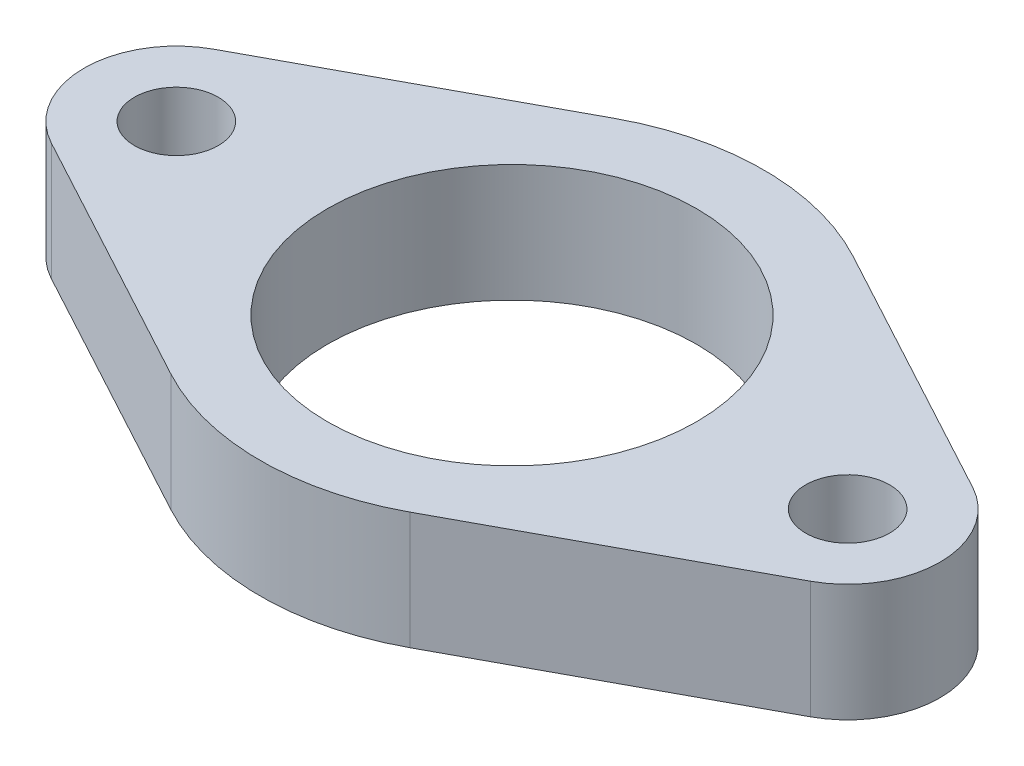
ISO-10303-21;
HEADER;
FILE_DESCRIPTION(('STEP AP214'),'2;1');
FILE_NAME('part.step','',(''),(''),'','','');
FILE_SCHEMA(('AUTOMOTIVE_DESIGN { 1 0 10303 214 1 1 1 1 }'));
ENDSEC;
DATA;
#1=APPLICATION_CONTEXT('core data for automotive mechanical design processes');
#2=APPLICATION_PROTOCOL_DEFINITION('international standard','automotive_design',2000,#1);
#3=PRODUCT_CONTEXT('',#1,'mechanical');
#4=PRODUCT('Part','Part','',(#3));
#5=PRODUCT_RELATED_PRODUCT_CATEGORY('part','',(#4));
#6=PRODUCT_DEFINITION_FORMATION('','',#4);
#7=PRODUCT_DEFINITION_CONTEXT('part definition',#1,'design');
#8=PRODUCT_DEFINITION('design','',#6,#7);
#9=PRODUCT_DEFINITION_SHAPE('','',#8);
#10=(LENGTH_UNIT() NAMED_UNIT(*) SI_UNIT(.MILLI.,.METRE.));
#11=(NAMED_UNIT(*) PLANE_ANGLE_UNIT() SI_UNIT($,.RADIAN.));
#12=(NAMED_UNIT(*) SI_UNIT($,.STERADIAN.) SOLID_ANGLE_UNIT());
#13=UNCERTAINTY_MEASURE_WITH_UNIT(LENGTH_MEASURE(1.E-05),#10,'distance_accuracy_value','');
#14=(GEOMETRIC_REPRESENTATION_CONTEXT(3) GLOBAL_UNCERTAINTY_ASSIGNED_CONTEXT((#13)) GLOBAL_UNIT_ASSIGNED_CONTEXT((#10,
#11,#12)) REPRESENTATION_CONTEXT('',''));
#15=CARTESIAN_POINT('',(0.,0.,0.));
#16=DIRECTION('',(0.,0.,1.));
#17=DIRECTION('',(1.,0.,0.));
#18=AXIS2_PLACEMENT_3D('',#15,#16,#17);
#19=CARTESIAN_POINT('',(-20.,7.,0.));
#20=DIRECTION('',(0.,1.,0.));
#21=DIRECTION('',(0.,0.,1.));
#22=AXIS2_PLACEMENT_3D('',#19,#20,#21);
#23=PLANE('',#22);
#24=CARTESIAN_POINT('',(-20.,7.,0.));
#25=DIRECTION('',(0.,1.,0.));
#26=DIRECTION('',(0.,0.,1.));
#27=AXIS2_PLACEMENT_3D('',#24,#25,#26);
#28=CIRCLE('',#27,2.5);
#29=CARTESIAN_POINT('',(-20.,7.,2.5));
#30=VERTEX_POINT('',#29);
#31=EDGE_CURVE('E184',#30,#30,#28,.T.);
#32=ORIENTED_EDGE('',*,*,#31,.F.);
#33=EDGE_LOOP('',(#32));
#34=FACE_BOUND('',#33,.T.);
#35=CARTESIAN_POINT('',(-20.,7.,0.));
#36=DIRECTION('',(0.,1.,0.));
#37=DIRECTION('',(0.,0.,1.));
#38=AXIS2_PLACEMENT_3D('',#35,#36,#37);
#39=CIRCLE('',#38,5.5);
#40=CARTESIAN_POINT('',(-22.6125,7.,-4.83992187436946));
#41=VERTEX_POINT('',#40);
#42=CARTESIAN_POINT('',(-22.6125,7.,4.83992187436946));
#43=VERTEX_POINT('',#42);
#44=EDGE_CURVE('E147',#41,#43,#39,.T.);
#45=ORIENTED_EDGE('',*,*,#44,.T.);
#46=DIRECTION('',(0.879985795339902,0.,0.475));
#47=VECTOR('',#46,1.);
#48=CARTESIAN_POINT('',(-22.6125,7.,4.83992187436946));
#49=LINE('',#48,#47);
#50=CARTESIAN_POINT('',(-7.125,7.,13.1997869300985));
#51=VERTEX_POINT('',#50);
#52=EDGE_CURVE('E95',#43,#51,#49,.T.);
#53=ORIENTED_EDGE('',*,*,#52,.T.);
#54=CARTESIAN_POINT('',(0.,7.,0.));
#55=DIRECTION('',(0.,1.,0.));
#56=DIRECTION('',(0.,0.,1.));
#57=AXIS2_PLACEMENT_3D('',#54,#55,#56);
#58=CIRCLE('',#57,15.);
#59=CARTESIAN_POINT('',(7.125,7.,13.1997869300985));
#60=VERTEX_POINT('',#59);
#61=EDGE_CURVE('E162',#51,#60,#58,.T.);
#62=ORIENTED_EDGE('',*,*,#61,.T.);
#63=DIRECTION('',(0.879985795339902,0.,-0.475));
#64=VECTOR('',#63,1.);
#65=CARTESIAN_POINT('',(22.6125,7.,4.83992187436946));
#66=LINE('',#65,#64);
#67=CARTESIAN_POINT('',(22.6125,7.,4.83992187436946));
#68=VERTEX_POINT('',#67);
#69=EDGE_CURVE('E175',#60,#68,#66,.T.);
#70=ORIENTED_EDGE('',*,*,#69,.T.);
#71=CARTESIAN_POINT('',(20.,7.,0.));
#72=DIRECTION('',(0.,1.,0.));
#73=DIRECTION('',(0.,0.,-1.));
#74=AXIS2_PLACEMENT_3D('',#71,#72,#73);
#75=CIRCLE('',#74,5.5);
#76=CARTESIAN_POINT('',(22.6125,7.,-4.83992187436946));
#77=VERTEX_POINT('',#76);
#78=EDGE_CURVE('E114',#68,#77,#75,.T.);
#79=ORIENTED_EDGE('',*,*,#78,.T.);
#80=DIRECTION('',(-0.879985795339902,0.,-0.475));
#81=VECTOR('',#80,1.);
#82=CARTESIAN_POINT('',(22.6125,7.,-4.83992187436946));
#83=LINE('',#82,#81);
#84=CARTESIAN_POINT('',(7.125,7.,-13.1997869300985));
#85=VERTEX_POINT('',#84);
#86=EDGE_CURVE('E108',#77,#85,#83,.T.);
#87=ORIENTED_EDGE('',*,*,#86,.T.);
#88=CARTESIAN_POINT('',(0.,7.,0.));
#89=DIRECTION('',(0.,1.,0.));
#90=DIRECTION('',(0.,0.,1.));
#91=AXIS2_PLACEMENT_3D('',#88,#89,#90);
#92=CIRCLE('',#91,15.);
#93=CARTESIAN_POINT('',(-7.125,7.,-13.1997869300985));
#94=VERTEX_POINT('',#93);
#95=EDGE_CURVE('E112',#85,#94,#92,.T.);
#96=ORIENTED_EDGE('',*,*,#95,.T.);
#97=DIRECTION('',(-0.879985795339902,0.,0.475));
#98=VECTOR('',#97,1.);
#99=CARTESIAN_POINT('',(-22.6125,7.,-4.83992187436946));
#100=LINE('',#99,#98);
#101=EDGE_CURVE('E52',#94,#41,#100,.T.);
#102=ORIENTED_EDGE('',*,*,#101,.T.);
#103=EDGE_LOOP('',(#45,#53,#62,#70,#79,#87,#96,#102));
#104=FACE_BOUND('',#103,.T.);
#105=CARTESIAN_POINT('',(0.,7.,0.));
#106=DIRECTION('',(0.,1.,0.));
#107=DIRECTION('',(0.,0.,1.));
#108=AXIS2_PLACEMENT_3D('',#105,#106,#107);
#109=CIRCLE('',#108,11.);
#110=CARTESIAN_POINT('',(0.,7.,11.));
#111=VERTEX_POINT('',#110);
#112=EDGE_CURVE('E136',#111,#111,#109,.T.);
#113=ORIENTED_EDGE('',*,*,#112,.F.);
#114=EDGE_LOOP('',(#113));
#115=FACE_BOUND('',#114,.T.);
#116=CARTESIAN_POINT('',(20.,7.,0.));
#117=DIRECTION('',(0.,1.,0.));
#118=DIRECTION('',(0.,0.,-1.));
#119=AXIS2_PLACEMENT_3D('',#116,#117,#118);
#120=CIRCLE('',#119,2.5);
#121=CARTESIAN_POINT('',(20.,7.,-2.5));
#122=VERTEX_POINT('',#121);
#123=EDGE_CURVE('E190',#122,#122,#120,.T.);
#124=ORIENTED_EDGE('',*,*,#123,.F.);
#125=EDGE_LOOP('',(#124));
#126=FACE_BOUND('',#125,.T.);
#127=ADVANCED_FACE('F35',(#34,#104,#115,#126),#23,.T.);
#128=CARTESIAN_POINT('',(-20.,0.,0.));
#129=DIRECTION('',(0.,1.,0.));
#130=DIRECTION('',(0.,0.,1.));
#131=AXIS2_PLACEMENT_3D('',#128,#129,#130);
#132=PLANE('',#131);
#133=CARTESIAN_POINT('',(-20.,0.,0.));
#134=DIRECTION('',(0.,1.,0.));
#135=DIRECTION('',(0.,0.,1.));
#136=AXIS2_PLACEMENT_3D('',#133,#134,#135);
#137=CIRCLE('',#136,5.5);
#138=CARTESIAN_POINT('',(-22.6125,0.,-4.83992187436946));
#139=VERTEX_POINT('',#138);
#140=CARTESIAN_POINT('',(-22.6125,0.,4.83992187436946));
#141=VERTEX_POINT('',#140);
#142=EDGE_CURVE('E132',#139,#141,#137,.T.);
#143=ORIENTED_EDGE('',*,*,#142,.F.);
#144=DIRECTION('',(-0.879985795339902,0.,0.475));
#145=VECTOR('',#144,1.);
#146=CARTESIAN_POINT('',(-22.6125,0.,-4.83992187436946));
#147=LINE('',#146,#145);
#148=CARTESIAN_POINT('',(-7.125,0.,-13.1997869300985));
#149=VERTEX_POINT('',#148);
#150=EDGE_CURVE('E87',#149,#139,#147,.T.);
#151=ORIENTED_EDGE('',*,*,#150,.F.);
#152=CARTESIAN_POINT('',(0.,0.,0.));
#153=DIRECTION('',(0.,1.,0.));
#154=DIRECTION('',(0.,0.,1.));
#155=AXIS2_PLACEMENT_3D('',#152,#153,#154);
#156=CIRCLE('',#155,15.);
#157=CARTESIAN_POINT('',(7.125,0.,-13.1997869300985));
#158=VERTEX_POINT('',#157);
#159=EDGE_CURVE('E81',#158,#149,#156,.T.);
#160=ORIENTED_EDGE('',*,*,#159,.F.);
#161=DIRECTION('',(-0.879985795339902,0.,-0.475));
#162=VECTOR('',#161,1.);
#163=CARTESIAN_POINT('',(22.6125,0.,-4.83992187436946));
#164=LINE('',#163,#162);
#165=CARTESIAN_POINT('',(22.6125,0.,-4.83992187436946));
#166=VERTEX_POINT('',#165);
#167=EDGE_CURVE('E122',#166,#158,#164,.T.);
#168=ORIENTED_EDGE('',*,*,#167,.F.);
#169=CARTESIAN_POINT('',(20.,0.,0.));
#170=DIRECTION('',(0.,1.,0.));
#171=DIRECTION('',(0.,0.,-1.));
#172=AXIS2_PLACEMENT_3D('',#169,#170,#171);
#173=CIRCLE('',#172,5.5);
#174=CARTESIAN_POINT('',(22.6125,0.,4.83992187436946));
#175=VERTEX_POINT('',#174);
#176=EDGE_CURVE('E142',#175,#166,#173,.T.);
#177=ORIENTED_EDGE('',*,*,#176,.F.);
#178=DIRECTION('',(0.879985795339902,0.,-0.475));
#179=VECTOR('',#178,1.);
#180=CARTESIAN_POINT('',(22.6125,0.,4.83992187436946));
#181=LINE('',#180,#179);
#182=CARTESIAN_POINT('',(7.125,0.,13.1997869300985));
#183=VERTEX_POINT('',#182);
#184=EDGE_CURVE('E140',#183,#175,#181,.T.);
#185=ORIENTED_EDGE('',*,*,#184,.F.);
#186=CARTESIAN_POINT('',(0.,0.,0.));
#187=DIRECTION('',(0.,1.,0.));
#188=DIRECTION('',(0.,0.,1.));
#189=AXIS2_PLACEMENT_3D('',#186,#187,#188);
#190=CIRCLE('',#189,15.);
#191=CARTESIAN_POINT('',(-7.125,0.,13.1997869300985));
#192=VERTEX_POINT('',#191);
#193=EDGE_CURVE('E138',#192,#183,#190,.T.);
#194=ORIENTED_EDGE('',*,*,#193,.F.);
#195=DIRECTION('',(0.879985795339902,0.,0.475));
#196=VECTOR('',#195,1.);
#197=CARTESIAN_POINT('',(-22.6125,0.,4.83992187436946));
#198=LINE('',#197,#196);
#199=EDGE_CURVE('E135',#141,#192,#198,.T.);
#200=ORIENTED_EDGE('',*,*,#199,.F.);
#201=EDGE_LOOP('',(#143,#151,#160,#168,#177,#185,#194,#200));
#202=FACE_BOUND('',#201,.T.);
#203=CARTESIAN_POINT('',(0.,0.,0.));
#204=DIRECTION('',(0.,1.,0.));
#205=DIRECTION('',(0.,0.,1.));
#206=AXIS2_PLACEMENT_3D('',#203,#204,#205);
#207=CIRCLE('',#206,11.);
#208=CARTESIAN_POINT('',(0.,0.,11.));
#209=VERTEX_POINT('',#208);
#210=EDGE_CURVE('E181',#209,#209,#207,.T.);
#211=ORIENTED_EDGE('',*,*,#210,.T.);
#212=EDGE_LOOP('',(#211));
#213=FACE_BOUND('',#212,.T.);
#214=CARTESIAN_POINT('',(-20.,0.,0.));
#215=DIRECTION('',(0.,1.,0.));
#216=DIRECTION('',(0.,0.,1.));
#217=AXIS2_PLACEMENT_3D('',#214,#215,#216);
#218=CIRCLE('',#217,2.5);
#219=CARTESIAN_POINT('',(-20.,0.,2.5));
#220=VERTEX_POINT('',#219);
#221=EDGE_CURVE('E187',#220,#220,#218,.T.);
#222=ORIENTED_EDGE('',*,*,#221,.T.);
#223=EDGE_LOOP('',(#222));
#224=FACE_BOUND('',#223,.T.);
#225=CARTESIAN_POINT('',(20.,0.,0.));
#226=DIRECTION('',(0.,1.,0.));
#227=DIRECTION('',(0.,0.,-1.));
#228=AXIS2_PLACEMENT_3D('',#225,#226,#227);
#229=CIRCLE('',#228,2.5);
#230=CARTESIAN_POINT('',(20.,0.,-2.5));
#231=VERTEX_POINT('',#230);
#232=EDGE_CURVE('E193',#231,#231,#229,.T.);
#233=ORIENTED_EDGE('',*,*,#232,.T.);
#234=EDGE_LOOP('',(#233));
#235=FACE_BOUND('',#234,.T.);
#236=ADVANCED_FACE('F166',(#202,#213,#224,#235),#132,.F.);
#237=CARTESIAN_POINT('',(-20.,7.,0.));
#238=DIRECTION('',(0.,-1.,0.));
#239=DIRECTION('',(0.,0.,-1.));
#240=AXIS2_PLACEMENT_3D('',#237,#238,#239);
#241=CYLINDRICAL_SURFACE('',#240,5.5);
#242=ORIENTED_EDGE('',*,*,#142,.T.);
#243=DIRECTION('',(0.,-1.,0.));
#244=VECTOR('',#243,1.);
#245=CARTESIAN_POINT('',(-22.6125,7.,4.83992187436946));
#246=LINE('',#245,#244);
#247=EDGE_CURVE('E11',#43,#141,#246,.T.);
#248=ORIENTED_EDGE('',*,*,#247,.F.);
#249=ORIENTED_EDGE('',*,*,#44,.F.);
#250=DIRECTION('',(0.,-1.,0.));
#251=VECTOR('',#250,1.);
#252=CARTESIAN_POINT('',(-22.6125,7.,-4.83992187436946));
#253=LINE('',#252,#251);
#254=EDGE_CURVE('E128',#41,#139,#253,.T.);
#255=ORIENTED_EDGE('',*,*,#254,.T.);
#256=EDGE_LOOP('',(#242,#248,#249,#255));
#257=FACE_BOUND('',#256,.T.);
#258=ADVANCED_FACE('F37',(#257),#241,.T.);
#259=CARTESIAN_POINT('',(-22.6125,7.,4.83992187436946));
#260=DIRECTION('',(0.475,0.,-0.879985795339902));
#261=DIRECTION('',(-0.879985795339902,0.,-0.475));
#262=AXIS2_PLACEMENT_3D('',#259,#260,#261);
#263=PLANE('',#262);
#264=ORIENTED_EDGE('',*,*,#199,.T.);
#265=DIRECTION('',(0.,-1.,0.));
#266=VECTOR('',#265,1.);
#267=CARTESIAN_POINT('',(-7.125,7.,13.1997869300985));
#268=LINE('',#267,#266);
#269=EDGE_CURVE('E44',#51,#192,#268,.T.);
#270=ORIENTED_EDGE('',*,*,#269,.F.);
#271=ORIENTED_EDGE('',*,*,#52,.F.);
#272=ORIENTED_EDGE('',*,*,#247,.T.);
#273=EDGE_LOOP('',(#264,#270,#271,#272));
#274=FACE_BOUND('',#273,.T.);
#275=ADVANCED_FACE('F226',(#274),#263,.F.);
#276=CARTESIAN_POINT('',(0.,7.,0.));
#277=DIRECTION('',(0.,-1.,0.));
#278=DIRECTION('',(0.,0.,-1.));
#279=AXIS2_PLACEMENT_3D('',#276,#277,#278);
#280=CYLINDRICAL_SURFACE('',#279,15.);
#281=ORIENTED_EDGE('',*,*,#193,.T.);
#282=DIRECTION('',(0.,-1.,0.));
#283=VECTOR('',#282,1.);
#284=CARTESIAN_POINT('',(7.125,7.,13.1997869300985));
#285=LINE('',#284,#283);
#286=EDGE_CURVE('E154',#60,#183,#285,.T.);
#287=ORIENTED_EDGE('',*,*,#286,.F.);
#288=ORIENTED_EDGE('',*,*,#61,.F.);
#289=ORIENTED_EDGE('',*,*,#269,.T.);
#290=EDGE_LOOP('',(#281,#287,#288,#289));
#291=FACE_BOUND('',#290,.T.);
#292=ADVANCED_FACE('F160',(#291),#280,.T.);
#293=CARTESIAN_POINT('',(22.6125,7.,4.83992187436946));
#294=DIRECTION('',(-0.475,0.,-0.879985795339902));
#295=DIRECTION('',(-0.879985795339902,0.,0.475));
#296=AXIS2_PLACEMENT_3D('',#293,#294,#295);
#297=PLANE('',#296);
#298=ORIENTED_EDGE('',*,*,#184,.T.);
#299=DIRECTION('',(0.,-1.,0.));
#300=VECTOR('',#299,1.);
#301=CARTESIAN_POINT('',(22.6125,7.,4.83992187436946));
#302=LINE('',#301,#300);
#303=EDGE_CURVE('E151',#68,#175,#302,.T.);
#304=ORIENTED_EDGE('',*,*,#303,.F.);
#305=ORIENTED_EDGE('',*,*,#69,.F.);
#306=ORIENTED_EDGE('',*,*,#286,.T.);
#307=EDGE_LOOP('',(#298,#304,#305,#306));
#308=FACE_BOUND('',#307,.T.);
#309=ADVANCED_FACE('F171',(#308),#297,.F.);
#310=CARTESIAN_POINT('',(20.,7.,0.));
#311=DIRECTION('',(0.,-1.,0.));
#312=DIRECTION('',(0.,0.,-1.));
#313=AXIS2_PLACEMENT_3D('',#310,#311,#312);
#314=CYLINDRICAL_SURFACE('',#313,5.5);
#315=ORIENTED_EDGE('',*,*,#176,.T.);
#316=DIRECTION('',(0.,-1.,0.));
#317=VECTOR('',#316,1.);
#318=CARTESIAN_POINT('',(22.6125,7.,-4.83992187436946));
#319=LINE('',#318,#317);
#320=EDGE_CURVE('E123',#77,#166,#319,.T.);
#321=ORIENTED_EDGE('',*,*,#320,.F.);
#322=ORIENTED_EDGE('',*,*,#78,.F.);
#323=ORIENTED_EDGE('',*,*,#303,.T.);
#324=EDGE_LOOP('',(#315,#321,#322,#323));
#325=FACE_BOUND('',#324,.T.);
#326=ADVANCED_FACE('F174',(#325),#314,.T.);
#327=CARTESIAN_POINT('',(22.6125,7.,-4.83992187436946));
#328=DIRECTION('',(-0.475,0.,0.879985795339902));
#329=DIRECTION('',(0.879985795339902,0.,0.475));
#330=AXIS2_PLACEMENT_3D('',#327,#328,#329);
#331=PLANE('',#330);
#332=ORIENTED_EDGE('',*,*,#167,.T.);
#333=DIRECTION('',(0.,-1.,0.));
#334=VECTOR('',#333,1.);
#335=CARTESIAN_POINT('',(7.125,7.,-13.1997869300985));
#336=LINE('',#335,#334);
#337=EDGE_CURVE('E119',#85,#158,#336,.T.);
#338=ORIENTED_EDGE('',*,*,#337,.F.);
#339=ORIENTED_EDGE('',*,*,#86,.F.);
#340=ORIENTED_EDGE('',*,*,#320,.T.);
#341=EDGE_LOOP('',(#332,#338,#339,#340));
#342=FACE_BOUND('',#341,.T.);
#343=ADVANCED_FACE('F120',(#342),#331,.F.);
#344=CARTESIAN_POINT('',(0.,7.,0.));
#345=DIRECTION('',(0.,-1.,0.));
#346=DIRECTION('',(0.,0.,-1.));
#347=AXIS2_PLACEMENT_3D('',#344,#345,#346);
#348=CYLINDRICAL_SURFACE('',#347,15.);
#349=ORIENTED_EDGE('',*,*,#159,.T.);
#350=DIRECTION('',(0.,-1.,0.));
#351=VECTOR('',#350,1.);
#352=CARTESIAN_POINT('',(-7.125,7.,-13.1997869300985));
#353=LINE('',#352,#351);
#354=EDGE_CURVE('E124',#94,#149,#353,.T.);
#355=ORIENTED_EDGE('',*,*,#354,.F.);
#356=ORIENTED_EDGE('',*,*,#95,.F.);
#357=ORIENTED_EDGE('',*,*,#337,.T.);
#358=EDGE_LOOP('',(#349,#355,#356,#357));
#359=FACE_BOUND('',#358,.T.);
#360=ADVANCED_FACE('F126',(#359),#348,.T.);
#361=CARTESIAN_POINT('',(-22.6125,7.,-4.83992187436946));
#362=DIRECTION('',(0.475,0.,0.879985795339902));
#363=DIRECTION('',(0.879985795339902,0.,-0.475));
#364=AXIS2_PLACEMENT_3D('',#361,#362,#363);
#365=PLANE('',#364);
#366=ORIENTED_EDGE('',*,*,#150,.T.);
#367=ORIENTED_EDGE('',*,*,#254,.F.);
#368=ORIENTED_EDGE('',*,*,#101,.F.);
#369=ORIENTED_EDGE('',*,*,#354,.T.);
#370=EDGE_LOOP('',(#366,#367,#368,#369));
#371=FACE_BOUND('',#370,.T.);
#372=ADVANCED_FACE('F214',(#371),#365,.F.);
#373=CARTESIAN_POINT('',(0.,7.,0.));
#374=DIRECTION('',(0.,-1.,0.));
#375=DIRECTION('',(0.,0.,-1.));
#376=AXIS2_PLACEMENT_3D('',#373,#374,#375);
#377=CYLINDRICAL_SURFACE('',#376,11.);
#378=ORIENTED_EDGE('',*,*,#112,.T.);
#379=EDGE_LOOP('',(#378));
#380=FACE_BOUND('',#379,.T.);
#381=ORIENTED_EDGE('',*,*,#210,.F.);
#382=EDGE_LOOP('',(#381));
#383=FACE_BOUND('',#382,.T.);
#384=ADVANCED_FACE('F211',(#380,#383),#377,.F.);
#385=CARTESIAN_POINT('',(-20.,7.,0.));
#386=DIRECTION('',(0.,-1.,0.));
#387=DIRECTION('',(0.,0.,-1.));
#388=AXIS2_PLACEMENT_3D('',#385,#386,#387);
#389=CYLINDRICAL_SURFACE('',#388,2.5);
#390=ORIENTED_EDGE('',*,*,#31,.T.);
#391=EDGE_LOOP('',(#390));
#392=FACE_BOUND('',#391,.T.);
#393=ORIENTED_EDGE('',*,*,#221,.F.);
#394=EDGE_LOOP('',(#393));
#395=FACE_BOUND('',#394,.T.);
#396=ADVANCED_FACE('F290',(#392,#395),#389,.F.);
#397=CARTESIAN_POINT('',(20.,7.,0.));
#398=DIRECTION('',(0.,-1.,0.));
#399=DIRECTION('',(0.,0.,-1.));
#400=AXIS2_PLACEMENT_3D('',#397,#398,#399);
#401=CYLINDRICAL_SURFACE('',#400,2.5);
#402=ORIENTED_EDGE('',*,*,#123,.T.);
#403=EDGE_LOOP('',(#402));
#404=FACE_BOUND('',#403,.T.);
#405=ORIENTED_EDGE('',*,*,#232,.F.);
#406=EDGE_LOOP('',(#405));
#407=FACE_BOUND('',#406,.T.);
#408=ADVANCED_FACE('F199',(#404,#407),#401,.F.);
#409=CLOSED_SHELL('',(#127,#236,#258,#275,#292,#309,#326,#343,#360,#372,#384,#396,#408));
#410=MANIFOLD_SOLID_BREP('B2',#409);
#411=ADVANCED_BREP_SHAPE_REPRESENTATION('',(#18,#410),#14);
#412=SHAPE_DEFINITION_REPRESENTATION(#9,#411);
ENDSEC;
END-ISO-10303-21;
